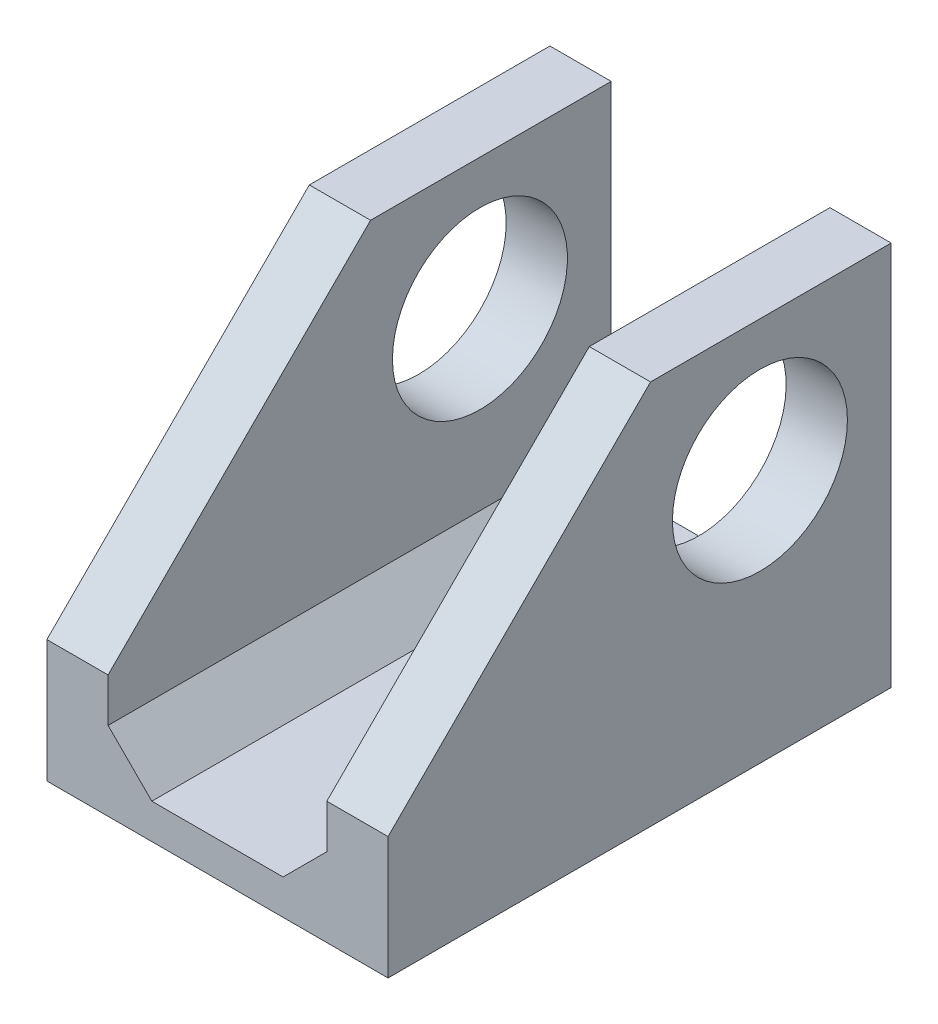
ISO-10303-21;
HEADER;
FILE_DESCRIPTION(('STEP AP214'),'2;1');
FILE_NAME('part.step','',(''),(''),'','','');
FILE_SCHEMA(('AUTOMOTIVE_DESIGN { 1 0 10303 214 1 1 1 1 }'));
ENDSEC;
DATA;
#1=APPLICATION_CONTEXT('core data for automotive mechanical design processes');
#2=APPLICATION_PROTOCOL_DEFINITION('international standard','automotive_design',2000,#1);
#3=PRODUCT_CONTEXT('',#1,'mechanical');
#4=PRODUCT('Part','Part','',(#3));
#5=PRODUCT_RELATED_PRODUCT_CATEGORY('part','',(#4));
#6=PRODUCT_DEFINITION_FORMATION('','',#4);
#7=PRODUCT_DEFINITION_CONTEXT('part definition',#1,'design');
#8=PRODUCT_DEFINITION('design','',#6,#7);
#9=PRODUCT_DEFINITION_SHAPE('','',#8);
#10=(LENGTH_UNIT() NAMED_UNIT(*) SI_UNIT(.MILLI.,.METRE.));
#11=(NAMED_UNIT(*) PLANE_ANGLE_UNIT() SI_UNIT($,.RADIAN.));
#12=(NAMED_UNIT(*) SI_UNIT($,.STERADIAN.) SOLID_ANGLE_UNIT());
#13=UNCERTAINTY_MEASURE_WITH_UNIT(LENGTH_MEASURE(1.E-05),#10,'distance_accuracy_value','');
#14=(GEOMETRIC_REPRESENTATION_CONTEXT(3) GLOBAL_UNCERTAINTY_ASSIGNED_CONTEXT((#13)) GLOBAL_UNIT_ASSIGNED_CONTEXT((#10,
#11,#12)) REPRESENTATION_CONTEXT('',''));
#15=CARTESIAN_POINT('',(0.,0.,0.));
#16=DIRECTION('',(0.,0.,1.));
#17=DIRECTION('',(1.,0.,0.));
#18=AXIS2_PLACEMENT_3D('',#15,#16,#17);
#19=CARTESIAN_POINT('',(0.,80.,85.));
#20=DIRECTION('',(1.,0.,0.));
#21=DIRECTION('',(0.,1.,0.));
#22=AXIS2_PLACEMENT_3D('',#19,#20,#21);
#23=PLANE('',#22);
#24=CARTESIAN_POINT('',(0.,50.,0.));
#25=DIRECTION('',(1.,0.,0.));
#26=DIRECTION('',(0.,1.,0.));
#27=AXIS2_PLACEMENT_3D('',#24,#25,#26);
#28=CIRCLE('',#27,20.);
#29=CARTESIAN_POINT('',(0.,70.,0.));
#30=VERTEX_POINT('',#29);
#31=EDGE_CURVE('E239',#30,#30,#28,.F.);
#32=ORIENTED_EDGE('',*,*,#31,.F.);
#33=EDGE_LOOP('',(#32));
#34=FACE_BOUND('',#33,.T.);
#35=DIRECTION('',(0.,-1.,0.));
#36=VECTOR('',#35,1.);
#37=CARTESIAN_POINT('',(0.,80.,85.));
#38=LINE('',#37,#36);
#39=CARTESIAN_POINT('',(0.,20.,85.));
#40=VERTEX_POINT('',#39);
#41=CARTESIAN_POINT('',(0.,9.99999999999997,85.));
#42=VERTEX_POINT('',#41);
#43=EDGE_CURVE('E162',#40,#42,#38,.T.);
#44=ORIENTED_EDGE('',*,*,#43,.F.);
#45=DIRECTION('',(0.,-0.707106781186546,0.707106781186549));
#46=VECTOR('',#45,1.);
#47=CARTESIAN_POINT('',(0.,20.,85.));
#48=LINE('',#47,#46);
#49=CARTESIAN_POINT('',(0.,80.,24.9999999999998));
#50=VERTEX_POINT('',#49);
#51=EDGE_CURVE('E209',#40,#50,#48,.F.);
#52=ORIENTED_EDGE('',*,*,#51,.T.);
#53=DIRECTION('',(0.,0.,-1.));
#54=VECTOR('',#53,1.);
#55=CARTESIAN_POINT('',(0.,80.,85.));
#56=LINE('',#55,#54);
#57=CARTESIAN_POINT('',(0.,80.,-30.));
#58=VERTEX_POINT('',#57);
#59=EDGE_CURVE('E177',#50,#58,#56,.T.);
#60=ORIENTED_EDGE('',*,*,#59,.T.);
#61=DIRECTION('',(0.,-1.,0.));
#62=VECTOR('',#61,1.);
#63=CARTESIAN_POINT('',(0.,80.,-30.));
#64=LINE('',#63,#62);
#65=CARTESIAN_POINT('',(0.,9.99999999999997,-30.));
#66=VERTEX_POINT('',#65);
#67=EDGE_CURVE('E236',#58,#66,#64,.T.);
#68=ORIENTED_EDGE('',*,*,#67,.T.);
#69=DIRECTION('',(0.,0.,1.));
#70=VECTOR('',#69,1.);
#71=CARTESIAN_POINT('',(0.,9.99999999999997,85.));
#72=LINE('',#71,#70);
#73=EDGE_CURVE('E192',#66,#42,#72,.T.);
#74=ORIENTED_EDGE('',*,*,#73,.T.);
#75=EDGE_LOOP('',(#44,#52,#60,#68,#74));
#76=FACE_BOUND('',#75,.T.);
#77=ADVANCED_FACE('F38',(#34,#76),#23,.F.);
#78=CARTESIAN_POINT('',(0.,0.,85.));
#79=DIRECTION('',(0.,-1.,0.));
#80=DIRECTION('',(1.,0.,0.));
#81=AXIS2_PLACEMENT_3D('',#78,#79,#80);
#82=PLANE('',#81);
#83=DIRECTION('',(-1.,0.,0.));
#84=VECTOR('',#83,1.);
#85=CARTESIAN_POINT('',(0.,0.,-30.));
#86=LINE('',#85,#84);
#87=CARTESIAN_POINT('',(-10.0000000000001,0.,-30.));
#88=VERTEX_POINT('',#87);
#89=CARTESIAN_POINT('',(-40.,0.,-30.));
#90=VERTEX_POINT('',#89);
#91=EDGE_CURVE('E141',#88,#90,#86,.T.);
#92=ORIENTED_EDGE('',*,*,#91,.T.);
#93=DIRECTION('',(0.,0.,1.));
#94=VECTOR('',#93,1.);
#95=CARTESIAN_POINT('',(-40.,0.,85.));
#96=LINE('',#95,#94);
#97=CARTESIAN_POINT('',(-40.,0.,85.));
#98=VERTEX_POINT('',#97);
#99=EDGE_CURVE('E190',#90,#98,#96,.T.);
#100=ORIENTED_EDGE('',*,*,#99,.T.);
#101=DIRECTION('',(-1.,0.,0.));
#102=VECTOR('',#101,1.);
#103=CARTESIAN_POINT('',(0.,0.,85.));
#104=LINE('',#103,#102);
#105=CARTESIAN_POINT('',(-10.0000000000001,0.,85.));
#106=VERTEX_POINT('',#105);
#107=EDGE_CURVE('E164',#106,#98,#104,.T.);
#108=ORIENTED_EDGE('',*,*,#107,.F.);
#109=DIRECTION('',(0.,0.,-1.));
#110=VECTOR('',#109,1.);
#111=CARTESIAN_POINT('',(-10.0000000000001,0.,-30.));
#112=LINE('',#111,#110);
#113=EDGE_CURVE('E187',#106,#88,#112,.T.);
#114=ORIENTED_EDGE('',*,*,#113,.T.);
#115=EDGE_LOOP('',(#92,#100,#108,#114));
#116=FACE_BOUND('',#115,.T.);
#117=ADVANCED_FACE('F266',(#116),#82,.F.);
#118=CARTESIAN_POINT('',(-50.,0.,85.));
#119=DIRECTION('',(-1.,0.,0.));
#120=DIRECTION('',(0.,0.,1.));
#121=AXIS2_PLACEMENT_3D('',#118,#119,#120);
#122=PLANE('',#121);
#123=CARTESIAN_POINT('',(-50.,50.,0.));
#124=DIRECTION('',(-1.,0.,0.));
#125=DIRECTION('',(0.,0.,1.));
#126=AXIS2_PLACEMENT_3D('',#123,#124,#125);
#127=CIRCLE('',#126,20.);
#128=CARTESIAN_POINT('',(-50.,50.,20.));
#129=VERTEX_POINT('',#128);
#130=EDGE_CURVE('E243',#129,#129,#127,.F.);
#131=ORIENTED_EDGE('',*,*,#130,.F.);
#132=EDGE_LOOP('',(#131));
#133=FACE_BOUND('',#132,.T.);
#134=DIRECTION('',(0.,0.,-1.));
#135=VECTOR('',#134,1.);
#136=CARTESIAN_POINT('',(-50.,80.,85.));
#137=LINE('',#136,#135);
#138=CARTESIAN_POINT('',(-50.,80.,24.9999999999998));
#139=VERTEX_POINT('',#138);
#140=CARTESIAN_POINT('',(-50.,80.,-30.));
#141=VERTEX_POINT('',#140);
#142=EDGE_CURVE('E124',#139,#141,#137,.T.);
#143=ORIENTED_EDGE('',*,*,#142,.F.);
#144=DIRECTION('',(0.,0.707106781186546,-0.707106781186549));
#145=VECTOR('',#144,1.);
#146=CARTESIAN_POINT('',(-50.,20.,85.));
#147=LINE('',#146,#145);
#148=CARTESIAN_POINT('',(-50.,20.,85.));
#149=VERTEX_POINT('',#148);
#150=EDGE_CURVE('E11',#139,#149,#147,.F.);
#151=ORIENTED_EDGE('',*,*,#150,.T.);
#152=DIRECTION('',(0.,1.,0.));
#153=VECTOR('',#152,1.);
#154=CARTESIAN_POINT('',(-50.,0.,85.));
#155=LINE('',#154,#153);
#156=CARTESIAN_POINT('',(-50.,10.0000000000001,85.));
#157=VERTEX_POINT('',#156);
#158=EDGE_CURVE('E167',#157,#149,#155,.T.);
#159=ORIENTED_EDGE('',*,*,#158,.F.);
#160=DIRECTION('',(0.,0.,-1.));
#161=VECTOR('',#160,1.);
#162=CARTESIAN_POINT('',(-50.,10.0000000000001,-30.));
#163=LINE('',#162,#161);
#164=CARTESIAN_POINT('',(-50.,10.0000000000001,-30.));
#165=VERTEX_POINT('',#164);
#166=EDGE_CURVE('E131',#157,#165,#163,.T.);
#167=ORIENTED_EDGE('',*,*,#166,.T.);
#168=DIRECTION('',(0.,1.,0.));
#169=VECTOR('',#168,1.);
#170=CARTESIAN_POINT('',(-50.,0.,-30.));
#171=LINE('',#170,#169);
#172=EDGE_CURVE('E136',#165,#141,#171,.T.);
#173=ORIENTED_EDGE('',*,*,#172,.T.);
#174=EDGE_LOOP('',(#143,#151,#159,#167,#173));
#175=FACE_BOUND('',#174,.T.);
#176=ADVANCED_FACE('F137',(#133,#175),#122,.F.);
#177=CARTESIAN_POINT('',(-50.,80.,85.));
#178=DIRECTION('',(0.,-1.,0.));
#179=DIRECTION('',(0.,0.,-1.));
#180=AXIS2_PLACEMENT_3D('',#177,#178,#179);
#181=PLANE('',#180);
#182=DIRECTION('',(0.,0.,-1.));
#183=VECTOR('',#182,1.);
#184=CARTESIAN_POINT('',(-64.,80.,85.));
#185=LINE('',#184,#183);
#186=CARTESIAN_POINT('',(-64.,80.,24.9999999999998));
#187=VERTEX_POINT('',#186);
#188=CARTESIAN_POINT('',(-64.,80.,-30.));
#189=VERTEX_POINT('',#188);
#190=EDGE_CURVE('E132',#187,#189,#185,.T.);
#191=ORIENTED_EDGE('',*,*,#190,.F.);
#192=DIRECTION('',(1.,0.,0.));
#193=VECTOR('',#192,1.);
#194=CARTESIAN_POINT('',(-50.,80.,24.9999999999998));
#195=LINE('',#194,#193);
#196=EDGE_CURVE('E47',#187,#139,#195,.T.);
#197=ORIENTED_EDGE('',*,*,#196,.T.);
#198=ORIENTED_EDGE('',*,*,#142,.T.);
#199=DIRECTION('',(-1.,0.,0.));
#200=VECTOR('',#199,1.);
#201=CARTESIAN_POINT('',(-50.,80.,-30.));
#202=LINE('',#201,#200);
#203=EDGE_CURVE('E128',#141,#189,#202,.T.);
#204=ORIENTED_EDGE('',*,*,#203,.T.);
#205=EDGE_LOOP('',(#191,#197,#198,#204));
#206=FACE_BOUND('',#205,.T.);
#207=ADVANCED_FACE('F126',(#206),#181,.F.);
#208=CARTESIAN_POINT('',(-64.,80.,85.));
#209=DIRECTION('',(1.,0.,0.));
#210=DIRECTION('',(0.,0.,-1.));
#211=AXIS2_PLACEMENT_3D('',#208,#209,#210);
#212=PLANE('',#211);
#213=CARTESIAN_POINT('',(-64.,50.,0.));
#214=DIRECTION('',(1.,0.,0.));
#215=DIRECTION('',(0.,0.,-1.));
#216=AXIS2_PLACEMENT_3D('',#213,#214,#215);
#217=CIRCLE('',#216,20.);
#218=CARTESIAN_POINT('',(-64.,50.,-20.));
#219=VERTEX_POINT('',#218);
#220=EDGE_CURVE('E251',#219,#219,#217,.T.);
#221=ORIENTED_EDGE('',*,*,#220,.T.);
#222=EDGE_LOOP('',(#221));
#223=FACE_BOUND('',#222,.T.);
#224=DIRECTION('',(0.,-1.,0.));
#225=VECTOR('',#224,1.);
#226=CARTESIAN_POINT('',(-64.,80.,85.));
#227=LINE('',#226,#225);
#228=CARTESIAN_POINT('',(-64.,20.,85.));
#229=VERTEX_POINT('',#228);
#230=CARTESIAN_POINT('',(-64.,-8.00000000000001,85.));
#231=VERTEX_POINT('',#230);
#232=EDGE_CURVE('E170',#229,#231,#227,.T.);
#233=ORIENTED_EDGE('',*,*,#232,.F.);
#234=DIRECTION('',(0.,-0.707106781186546,0.707106781186549));
#235=VECTOR('',#234,1.);
#236=CARTESIAN_POINT('',(-64.,20.,85.));
#237=LINE('',#236,#235);
#238=EDGE_CURVE('E61',#229,#187,#237,.F.);
#239=ORIENTED_EDGE('',*,*,#238,.T.);
#240=ORIENTED_EDGE('',*,*,#190,.T.);
#241=DIRECTION('',(0.,-1.,0.));
#242=VECTOR('',#241,1.);
#243=CARTESIAN_POINT('',(-64.,80.,-30.));
#244=LINE('',#243,#242);
#245=CARTESIAN_POINT('',(-64.,-8.00000000000001,-30.));
#246=VERTEX_POINT('',#245);
#247=EDGE_CURVE('E148',#189,#246,#244,.T.);
#248=ORIENTED_EDGE('',*,*,#247,.T.);
#249=DIRECTION('',(0.,0.,-1.));
#250=VECTOR('',#249,1.);
#251=CARTESIAN_POINT('',(-64.,-8.00000000000001,85.));
#252=LINE('',#251,#250);
#253=EDGE_CURVE('E183',#231,#246,#252,.T.);
#254=ORIENTED_EDGE('',*,*,#253,.F.);
#255=EDGE_LOOP('',(#233,#239,#240,#248,#254));
#256=FACE_BOUND('',#255,.T.);
#257=ADVANCED_FACE('F255',(#223,#256),#212,.F.);
#258=CARTESIAN_POINT('',(-64.,-8.00000000000001,85.));
#259=DIRECTION('',(0.,1.,0.));
#260=DIRECTION('',(-1.,0.,0.));
#261=AXIS2_PLACEMENT_3D('',#258,#259,#260);
#262=PLANE('',#261);
#263=ORIENTED_EDGE('',*,*,#253,.T.);
#264=DIRECTION('',(1.,0.,0.));
#265=VECTOR('',#264,1.);
#266=CARTESIAN_POINT('',(-64.,-8.00000000000001,-30.));
#267=LINE('',#266,#265);
#268=CARTESIAN_POINT('',(14.,-8.00000000000001,-30.));
#269=VERTEX_POINT('',#268);
#270=EDGE_CURVE('E150',#246,#269,#267,.T.);
#271=ORIENTED_EDGE('',*,*,#270,.T.);
#272=DIRECTION('',(0.,0.,-1.));
#273=VECTOR('',#272,1.);
#274=CARTESIAN_POINT('',(14.,-8.00000000000001,85.));
#275=LINE('',#274,#273);
#276=CARTESIAN_POINT('',(14.,-8.00000000000001,85.));
#277=VERTEX_POINT('',#276);
#278=EDGE_CURVE('E181',#277,#269,#275,.T.);
#279=ORIENTED_EDGE('',*,*,#278,.F.);
#280=DIRECTION('',(1.,0.,0.));
#281=VECTOR('',#280,1.);
#282=CARTESIAN_POINT('',(-64.,-8.00000000000001,85.));
#283=LINE('',#282,#281);
#284=EDGE_CURVE('E172',#231,#277,#283,.T.);
#285=ORIENTED_EDGE('',*,*,#284,.F.);
#286=EDGE_LOOP('',(#263,#271,#279,#285));
#287=FACE_BOUND('',#286,.T.);
#288=ADVANCED_FACE('F312',(#287),#262,.F.);
#289=CARTESIAN_POINT('',(14.,-8.00000000000001,85.));
#290=DIRECTION('',(-1.,0.,0.));
#291=DIRECTION('',(0.,0.,1.));
#292=AXIS2_PLACEMENT_3D('',#289,#290,#291);
#293=PLANE('',#292);
#294=CARTESIAN_POINT('',(14.,50.,0.));
#295=DIRECTION('',(1.,0.,0.));
#296=DIRECTION('',(0.,0.,-1.));
#297=AXIS2_PLACEMENT_3D('',#294,#295,#296);
#298=CIRCLE('',#297,20.);
#299=CARTESIAN_POINT('',(14.,50.,-20.));
#300=VERTEX_POINT('',#299);
#301=EDGE_CURVE('E248',#300,#300,#298,.T.);
#302=ORIENTED_EDGE('',*,*,#301,.F.);
#303=EDGE_LOOP('',(#302));
#304=FACE_BOUND('',#303,.T.);
#305=DIRECTION('',(0.,0.,-1.));
#306=VECTOR('',#305,1.);
#307=CARTESIAN_POINT('',(14.,80.,85.));
#308=LINE('',#307,#306);
#309=CARTESIAN_POINT('',(14.,80.,24.9999999999998));
#310=VERTEX_POINT('',#309);
#311=CARTESIAN_POINT('',(14.,80.,-30.));
#312=VERTEX_POINT('',#311);
#313=EDGE_CURVE('E179',#310,#312,#308,.T.);
#314=ORIENTED_EDGE('',*,*,#313,.F.);
#315=DIRECTION('',(0.,0.707106781186546,-0.707106781186549));
#316=VECTOR('',#315,1.);
#317=CARTESIAN_POINT('',(14.,20.,85.));
#318=LINE('',#317,#316);
#319=CARTESIAN_POINT('',(14.,20.,85.));
#320=VERTEX_POINT('',#319);
#321=EDGE_CURVE('E213',#310,#320,#318,.F.);
#322=ORIENTED_EDGE('',*,*,#321,.T.);
#323=DIRECTION('',(0.,1.,0.));
#324=VECTOR('',#323,1.);
#325=CARTESIAN_POINT('',(14.,-8.00000000000001,85.));
#326=LINE('',#325,#324);
#327=EDGE_CURVE('E174',#277,#320,#326,.T.);
#328=ORIENTED_EDGE('',*,*,#327,.F.);
#329=ORIENTED_EDGE('',*,*,#278,.T.);
#330=DIRECTION('',(0.,1.,0.));
#331=VECTOR('',#330,1.);
#332=CARTESIAN_POINT('',(14.,-8.00000000000001,-30.));
#333=LINE('',#332,#331);
#334=EDGE_CURVE('E156',#269,#312,#333,.T.);
#335=ORIENTED_EDGE('',*,*,#334,.T.);
#336=EDGE_LOOP('',(#314,#322,#328,#329,#335));
#337=FACE_BOUND('',#336,.T.);
#338=ADVANCED_FACE('F219',(#304,#337),#293,.F.);
#339=CARTESIAN_POINT('',(14.,80.,85.));
#340=DIRECTION('',(0.,-1.,0.));
#341=DIRECTION('',(0.,0.,-1.));
#342=AXIS2_PLACEMENT_3D('',#339,#340,#341);
#343=PLANE('',#342);
#344=ORIENTED_EDGE('',*,*,#59,.F.);
#345=DIRECTION('',(1.,0.,0.));
#346=VECTOR('',#345,1.);
#347=CARTESIAN_POINT('',(14.,80.,24.9999999999998));
#348=LINE('',#347,#346);
#349=EDGE_CURVE('E211',#50,#310,#348,.T.);
#350=ORIENTED_EDGE('',*,*,#349,.T.);
#351=ORIENTED_EDGE('',*,*,#313,.T.);
#352=DIRECTION('',(-1.,0.,0.));
#353=VECTOR('',#352,1.);
#354=CARTESIAN_POINT('',(14.,80.,-30.));
#355=LINE('',#354,#353);
#356=EDGE_CURVE('E159',#312,#58,#355,.T.);
#357=ORIENTED_EDGE('',*,*,#356,.T.);
#358=EDGE_LOOP('',(#344,#350,#351,#357));
#359=FACE_BOUND('',#358,.T.);
#360=ADVANCED_FACE('F233',(#359),#343,.F.);
#361=CARTESIAN_POINT('',(0.,0.,85.));
#362=DIRECTION('',(0.,0.,-1.));
#363=DIRECTION('',(-1.,0.,0.));
#364=AXIS2_PLACEMENT_3D('',#361,#362,#363);
#365=PLANE('',#364);
#366=ORIENTED_EDGE('',*,*,#327,.T.);
#367=DIRECTION('',(-1.,0.,0.));
#368=VECTOR('',#367,1.);
#369=CARTESIAN_POINT('',(0.,20.,85.));
#370=LINE('',#369,#368);
#371=EDGE_CURVE('E206',#320,#40,#370,.T.);
#372=ORIENTED_EDGE('',*,*,#371,.T.);
#373=ORIENTED_EDGE('',*,*,#43,.T.);
#374=DIRECTION('',(0.707106781186551,0.707106781186544,0.));
#375=VECTOR('',#374,1.);
#376=CARTESIAN_POINT('',(-4.99999999999998,5.00000000000003,85.));
#377=LINE('',#376,#375);
#378=EDGE_CURVE('E201',#42,#106,#377,.F.);
#379=ORIENTED_EDGE('',*,*,#378,.T.);
#380=ORIENTED_EDGE('',*,*,#107,.T.);
#381=DIRECTION('',(0.707106781186544,-0.707106781186551,0.));
#382=VECTOR('',#381,1.);
#383=CARTESIAN_POINT('',(-20.0000000000002,-20.,85.));
#384=LINE('',#383,#382);
#385=EDGE_CURVE('E197',#98,#157,#384,.F.);
#386=ORIENTED_EDGE('',*,*,#385,.T.);
#387=ORIENTED_EDGE('',*,*,#158,.T.);
#388=DIRECTION('',(-1.,0.,0.));
#389=VECTOR('',#388,1.);
#390=CARTESIAN_POINT('',(0.,20.,85.));
#391=LINE('',#390,#389);
#392=EDGE_CURVE('E203',#149,#229,#391,.T.);
#393=ORIENTED_EDGE('',*,*,#392,.T.);
#394=ORIENTED_EDGE('',*,*,#232,.T.);
#395=ORIENTED_EDGE('',*,*,#284,.T.);
#396=EDGE_LOOP('',(#366,#372,#373,#379,#380,#386,#387,#393,#394,#395));
#397=FACE_BOUND('',#396,.T.);
#398=ADVANCED_FACE('F224',(#397),#365,.F.);
#399=CARTESIAN_POINT('',(0.,0.,-30.));
#400=DIRECTION('',(0.,0.,-1.));
#401=DIRECTION('',(-1.,0.,0.));
#402=AXIS2_PLACEMENT_3D('',#399,#400,#401);
#403=PLANE('',#402);
#404=ORIENTED_EDGE('',*,*,#67,.F.);
#405=ORIENTED_EDGE('',*,*,#356,.F.);
#406=ORIENTED_EDGE('',*,*,#334,.F.);
#407=ORIENTED_EDGE('',*,*,#270,.F.);
#408=ORIENTED_EDGE('',*,*,#247,.F.);
#409=ORIENTED_EDGE('',*,*,#203,.F.);
#410=ORIENTED_EDGE('',*,*,#172,.F.);
#411=DIRECTION('',(-0.707106781186544,0.707106781186551,0.));
#412=VECTOR('',#411,1.);
#413=CARTESIAN_POINT('',(-50.,10.0000000000001,-30.));
#414=LINE('',#413,#412);
#415=EDGE_CURVE('E195',#165,#90,#414,.F.);
#416=ORIENTED_EDGE('',*,*,#415,.T.);
#417=ORIENTED_EDGE('',*,*,#91,.F.);
#418=DIRECTION('',(-0.707106781186551,-0.707106781186544,0.));
#419=VECTOR('',#418,1.);
#420=CARTESIAN_POINT('',(-10.0000000000001,0.,-30.));
#421=LINE('',#420,#419);
#422=EDGE_CURVE('E199',#88,#66,#421,.F.);
#423=ORIENTED_EDGE('',*,*,#422,.T.);
#424=EDGE_LOOP('',(#404,#405,#406,#407,#408,#409,#410,#416,#417,#423));
#425=FACE_BOUND('',#424,.T.);
#426=ADVANCED_FACE('F145',(#425),#403,.T.);
#427=CARTESIAN_POINT('',(14.,50.,0.));
#428=DIRECTION('',(-1.,0.,0.));
#429=DIRECTION('',(0.,0.,1.));
#430=AXIS2_PLACEMENT_3D('',#427,#428,#429);
#431=CYLINDRICAL_SURFACE('',#430,20.);
#432=ORIENTED_EDGE('',*,*,#301,.T.);
#433=EDGE_LOOP('',(#432));
#434=FACE_BOUND('',#433,.T.);
#435=ORIENTED_EDGE('',*,*,#31,.T.);
#436=EDGE_LOOP('',(#435));
#437=FACE_BOUND('',#436,.T.);
#438=ADVANCED_FACE('F261',(#434,#437),#431,.F.);
#439=ORIENTED_EDGE('',*,*,#220,.F.);
#440=EDGE_LOOP('',(#439));
#441=FACE_BOUND('',#440,.T.);
#442=ORIENTED_EDGE('',*,*,#130,.T.);
#443=EDGE_LOOP('',(#442));
#444=FACE_BOUND('',#443,.T.);
#445=ADVANCED_FACE('F257',(#441,#444),#431,.F.);
#446=CARTESIAN_POINT('',(-50.,10.0000000000001,85.));
#447=DIRECTION('',(0.707106781186552,0.707106781186544,0.));
#448=DIRECTION('',(0.,0.,1.));
#449=AXIS2_PLACEMENT_3D('',#446,#447,#448);
#450=PLANE('',#449);
#451=ORIENTED_EDGE('',*,*,#385,.F.);
#452=ORIENTED_EDGE('',*,*,#99,.F.);
#453=ORIENTED_EDGE('',*,*,#415,.F.);
#454=ORIENTED_EDGE('',*,*,#166,.F.);
#455=EDGE_LOOP('',(#451,#452,#453,#454));
#456=FACE_BOUND('',#455,.T.);
#457=ADVANCED_FACE('F260',(#456),#450,.T.);
#458=CARTESIAN_POINT('',(-10.0000000000001,0.,85.));
#459=DIRECTION('',(-0.707106781186544,0.707106781186551,0.));
#460=DIRECTION('',(0.,0.,1.));
#461=AXIS2_PLACEMENT_3D('',#458,#459,#460);
#462=PLANE('',#461);
#463=ORIENTED_EDGE('',*,*,#378,.F.);
#464=ORIENTED_EDGE('',*,*,#73,.F.);
#465=ORIENTED_EDGE('',*,*,#422,.F.);
#466=ORIENTED_EDGE('',*,*,#113,.F.);
#467=EDGE_LOOP('',(#463,#464,#465,#466));
#468=FACE_BOUND('',#467,.T.);
#469=ADVANCED_FACE('F288',(#468),#462,.T.);
#470=CARTESIAN_POINT('',(0.,20.,85.));
#471=DIRECTION('',(0.,-0.707106781186549,-0.707106781186546));
#472=DIRECTION('',(-1.,0.,0.));
#473=AXIS2_PLACEMENT_3D('',#470,#471,#472);
#474=PLANE('',#473);
#475=ORIENTED_EDGE('',*,*,#321,.F.);
#476=ORIENTED_EDGE('',*,*,#349,.F.);
#477=ORIENTED_EDGE('',*,*,#51,.F.);
#478=ORIENTED_EDGE('',*,*,#371,.F.);
#479=EDGE_LOOP('',(#475,#476,#477,#478));
#480=FACE_BOUND('',#479,.T.);
#481=ADVANCED_FACE('F228',(#480),#474,.F.);
#482=CARTESIAN_POINT('',(0.,20.,85.));
#483=DIRECTION('',(0.,-0.707106781186549,-0.707106781186546));
#484=DIRECTION('',(-1.,0.,0.));
#485=AXIS2_PLACEMENT_3D('',#482,#483,#484);
#486=PLANE('',#485);
#487=ORIENTED_EDGE('',*,*,#150,.F.);
#488=ORIENTED_EDGE('',*,*,#196,.F.);
#489=ORIENTED_EDGE('',*,*,#238,.F.);
#490=ORIENTED_EDGE('',*,*,#392,.F.);
#491=EDGE_LOOP('',(#487,#488,#489,#490));
#492=FACE_BOUND('',#491,.T.);
#493=ADVANCED_FACE('F41',(#492),#486,.F.);
#494=CLOSED_SHELL('',(#77,#117,#176,#207,#257,#288,#338,#360,#398,#426,#438,#445,#457,#469,#481,#493));
#495=MANIFOLD_SOLID_BREP('B2',#494);
#496=ADVANCED_BREP_SHAPE_REPRESENTATION('',(#18,#495),#14);
#497=SHAPE_DEFINITION_REPRESENTATION(#9,#496);
ENDSEC;
END-ISO-10303-21;
